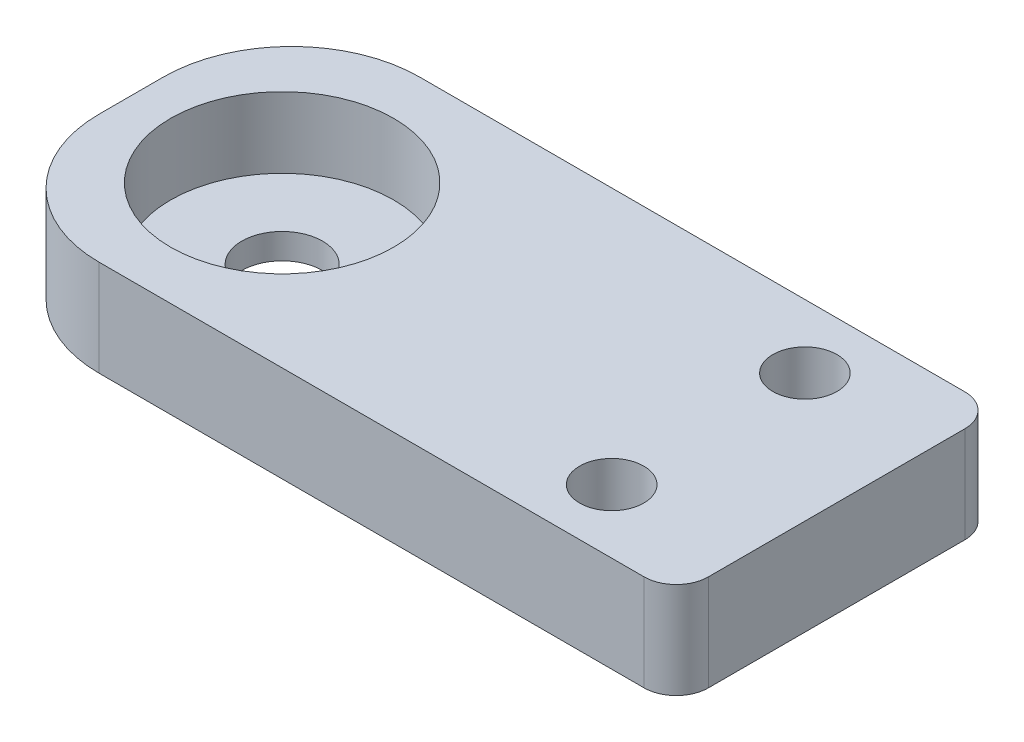
ISO-10303-21;
HEADER;
FILE_DESCRIPTION(('STEP AP214'),'2;1');
FILE_NAME('part.step','',(''),(''),'','','');
FILE_SCHEMA(('AUTOMOTIVE_DESIGN { 1 0 10303 214 1 1 1 1 }'));
ENDSEC;
DATA;
#1=APPLICATION_CONTEXT('core data for automotive mechanical design processes');
#2=APPLICATION_PROTOCOL_DEFINITION('international standard','automotive_design',2000,#1);
#3=PRODUCT_CONTEXT('',#1,'mechanical');
#4=PRODUCT('Part','Part','',(#3));
#5=PRODUCT_RELATED_PRODUCT_CATEGORY('part','',(#4));
#6=PRODUCT_DEFINITION_FORMATION('','',#4);
#7=PRODUCT_DEFINITION_CONTEXT('part definition',#1,'design');
#8=PRODUCT_DEFINITION('design','',#6,#7);
#9=PRODUCT_DEFINITION_SHAPE('','',#8);
#10=(LENGTH_UNIT() NAMED_UNIT(*) SI_UNIT(.MILLI.,.METRE.));
#11=(NAMED_UNIT(*) PLANE_ANGLE_UNIT() SI_UNIT($,.RADIAN.));
#12=(NAMED_UNIT(*) SI_UNIT($,.STERADIAN.) SOLID_ANGLE_UNIT());
#13=UNCERTAINTY_MEASURE_WITH_UNIT(LENGTH_MEASURE(1.E-05),#10,'distance_accuracy_value','');
#14=(GEOMETRIC_REPRESENTATION_CONTEXT(3) GLOBAL_UNCERTAINTY_ASSIGNED_CONTEXT((#13)) GLOBAL_UNIT_ASSIGNED_CONTEXT((#10,
#11,#12)) REPRESENTATION_CONTEXT('',''));
#15=CARTESIAN_POINT('',(0.,0.,0.));
#16=DIRECTION('',(0.,0.,1.));
#17=DIRECTION('',(1.,0.,0.));
#18=AXIS2_PLACEMENT_3D('',#15,#16,#17);
#19=CARTESIAN_POINT('',(14.950000072,9.525,-15.875));
#20=DIRECTION('',(0.,-1.,0.));
#21=DIRECTION('',(0.,0.,-1.));
#22=AXIS2_PLACEMENT_3D('',#19,#20,#21);
#23=CYLINDRICAL_SURFACE('',#22,4.);
#24=CARTESIAN_POINT('',(14.950000072,0.,-15.875));
#25=DIRECTION('',(0.,1.,0.));
#26=DIRECTION('',(0.,0.,1.));
#27=AXIS2_PLACEMENT_3D('',#24,#25,#26);
#28=CIRCLE('',#27,4.);
#29=CARTESIAN_POINT('',(14.950000072,0.,-19.875));
#30=VERTEX_POINT('',#29);
#31=EDGE_CURVE('E127',#30,#30,#28,.T.);
#32=CARTESIAN_POINT('',(14.950000072,2.525,-15.875));
#33=DIRECTION('',(0.,1.,0.));
#34=DIRECTION('',(0.,0.,1.));
#35=AXIS2_PLACEMENT_3D('',#32,#33,#34);
#36=CIRCLE('',#35,4.);
#37=CARTESIAN_POINT('',(14.950000072,2.525,-19.875));
#38=VERTEX_POINT('',#37);
#39=EDGE_CURVE('E141',#38,#38,#36,.T.);
#40=CARTESIAN_POINT('',(14.950000072,0.,-19.875));
#41=CARTESIAN_POINT('',(14.950000072,0.0263020833333333,-19.875));
#42=CARTESIAN_POINT('',(14.950000072,0.0526041666666667,-19.875));
#43=CARTESIAN_POINT('',(14.950000072,0.105208333333333,-19.875));
#44=CARTESIAN_POINT('',(14.950000072,0.131510416666667,-19.875));
#45=CARTESIAN_POINT('',(14.950000072,0.184114583333333,-19.875));
#46=CARTESIAN_POINT('',(14.950000072,0.210416666666667,-19.875));
#47=CARTESIAN_POINT('',(14.950000072,0.263020833333333,-19.875));
#48=CARTESIAN_POINT('',(14.950000072,0.289322916666667,-19.875));
#49=CARTESIAN_POINT('',(14.950000072,0.341927083333333,-19.875));
#50=CARTESIAN_POINT('',(14.950000072,0.368229166666667,-19.875));
#51=CARTESIAN_POINT('',(14.950000072,0.420833333333333,-19.875));
#52=CARTESIAN_POINT('',(14.950000072,0.447135416666667,-19.875));
#53=CARTESIAN_POINT('',(14.950000072,0.499739583333333,-19.875));
#54=CARTESIAN_POINT('',(14.950000072,0.526041666666667,-19.875));
#55=CARTESIAN_POINT('',(14.950000072,0.578645833333333,-19.875));
#56=CARTESIAN_POINT('',(14.950000072,0.604947916666666,-19.875));
#57=CARTESIAN_POINT('',(14.950000072,0.657552083333333,-19.875));
#58=CARTESIAN_POINT('',(14.950000072,0.683854166666667,-19.875));
#59=CARTESIAN_POINT('',(14.950000072,0.736458333333333,-19.875));
#60=CARTESIAN_POINT('',(14.950000072,0.762760416666666,-19.875));
#61=CARTESIAN_POINT('',(14.950000072,0.815364583333333,-19.875));
#62=CARTESIAN_POINT('',(14.950000072,0.841666666666666,-19.875));
#63=CARTESIAN_POINT('',(14.950000072,0.894270833333333,-19.875));
#64=CARTESIAN_POINT('',(14.950000072,0.920572916666666,-19.875));
#65=CARTESIAN_POINT('',(14.950000072,0.973177083333333,-19.875));
#66=CARTESIAN_POINT('',(14.950000072,0.999479166666666,-19.875));
#67=CARTESIAN_POINT('',(14.950000072,1.05208333333333,-19.875));
#68=CARTESIAN_POINT('',(14.950000072,1.07838541666667,-19.875));
#69=CARTESIAN_POINT('',(14.950000072,1.13098958333333,-19.875));
#70=CARTESIAN_POINT('',(14.950000072,1.15729166666667,-19.875));
#71=CARTESIAN_POINT('',(14.950000072,1.20989583333333,-19.875));
#72=CARTESIAN_POINT('',(14.950000072,1.23619791666667,-19.875));
#73=CARTESIAN_POINT('',(14.950000072,1.28880208333333,-19.875));
#74=CARTESIAN_POINT('',(14.950000072,1.31510416666667,-19.875));
#75=CARTESIAN_POINT('',(14.950000072,1.36770833333333,-19.875));
#76=CARTESIAN_POINT('',(14.950000072,1.39401041666667,-19.875));
#77=CARTESIAN_POINT('',(14.950000072,1.44661458333333,-19.875));
#78=CARTESIAN_POINT('',(14.950000072,1.47291666666667,-19.875));
#79=CARTESIAN_POINT('',(14.950000072,1.52552083333333,-19.875));
#80=CARTESIAN_POINT('',(14.950000072,1.55182291666667,-19.875));
#81=CARTESIAN_POINT('',(14.950000072,1.60442708333333,-19.875));
#82=CARTESIAN_POINT('',(14.950000072,1.63072916666667,-19.875));
#83=CARTESIAN_POINT('',(14.950000072,1.68333333333333,-19.875));
#84=CARTESIAN_POINT('',(14.950000072,1.70963541666667,-19.875));
#85=CARTESIAN_POINT('',(14.950000072,1.76223958333333,-19.875));
#86=CARTESIAN_POINT('',(14.950000072,1.78854166666667,-19.875));
#87=CARTESIAN_POINT('',(14.950000072,1.84114583333333,-19.875));
#88=CARTESIAN_POINT('',(14.950000072,1.86744791666667,-19.875));
#89=CARTESIAN_POINT('',(14.950000072,1.92005208333333,-19.875));
#90=CARTESIAN_POINT('',(14.950000072,1.94635416666667,-19.875));
#91=CARTESIAN_POINT('',(14.950000072,1.99895833333333,-19.875));
#92=CARTESIAN_POINT('',(14.950000072,2.02526041666667,-19.875));
#93=CARTESIAN_POINT('',(14.950000072,2.07786458333333,-19.875));
#94=CARTESIAN_POINT('',(14.950000072,2.10416666666667,-19.875));
#95=CARTESIAN_POINT('',(14.950000072,2.15677083333333,-19.875));
#96=CARTESIAN_POINT('',(14.950000072,2.18307291666667,-19.875));
#97=CARTESIAN_POINT('',(14.950000072,2.23567708333333,-19.875));
#98=CARTESIAN_POINT('',(14.950000072,2.26197916666667,-19.875));
#99=CARTESIAN_POINT('',(14.950000072,2.31458333333333,-19.875));
#100=CARTESIAN_POINT('',(14.950000072,2.34088541666667,-19.875));
#101=CARTESIAN_POINT('',(14.950000072,2.39348958333333,-19.875));
#102=CARTESIAN_POINT('',(14.950000072,2.41979166666667,-19.875));
#103=CARTESIAN_POINT('',(14.950000072,2.47239583333333,-19.875));
#104=CARTESIAN_POINT('',(14.950000072,2.49869791666667,-19.875));
#105=CARTESIAN_POINT('',(14.950000072,2.525,-19.875));
#106=B_SPLINE_CURVE_WITH_KNOTS('',3,(#40,#41,#42,#43,#44,#45,#46,#47,#48,#49,#50,#51,#52,#53,
#54,#55,#56,#57,#58,#59,#60,#61,#62,#63,#64,#65,#66,#67,#68,#69,#70,#71,#72,#73,#74,#75,#76,#77,
#78,#79,#80,#81,#82,#83,#84,#85,#86,#87,#88,#89,#90,#91,#92,#93,#94,#95,#96,#97,#98,#99,#100,
#101,#102,#103,#104,#105),.UNSPECIFIED.,.F.,.F.,(4,2,2,2,2,2,2,2,2,2,2,2,2,2,2,2,2,2,2,2,2,2,2,
2,2,2,2,2,2,2,2,2,4),(0.,0.07890625,0.1578125,0.23671875,0.315625,0.39453125,0.4734375,
0.55234375,0.63125,0.71015625,0.7890625,0.86796875,0.946875,1.02578125,1.1046875,1.18359375,
1.2625,1.34140625,1.4203125,1.49921875,1.578125,1.65703125,1.7359375,1.81484375,1.89375,
1.97265625,2.0515625,2.13046875,2.209375,2.28828125,2.3671875,2.44609375,2.525),.UNSPECIFIED.);
#107=EDGE_CURVE('BSEAM33',#30,#38,#106,.T.);
#108=ORIENTED_EDGE('',*,*,#31,.F.);
#109=ORIENTED_EDGE('',*,*,#39,.T.);
#110=ORIENTED_EDGE('',*,*,#107,.T.);
#111=ORIENTED_EDGE('',*,*,#107,.F.);
#112=EDGE_LOOP('',(#108,#110,#109,#111));
#113=FACE_BOUND('',#112,.T.);
#114=ADVANCED_FACE('F33',(#113),#23,.F.);
#115=CARTESIAN_POINT('',(0.,9.525,0.));
#116=DIRECTION('',(0.,-1.,0.));
#117=DIRECTION('',(0.,0.,-1.));
#118=AXIS2_PLACEMENT_3D('',#115,#116,#117);
#119=PLANE('',#118);
#120=CARTESIAN_POINT('',(14.950000072,9.525,-15.875));
#121=DIRECTION('',(0.,1.,0.));
#122=DIRECTION('',(0.,0.,1.));
#123=AXIS2_PLACEMENT_3D('',#120,#121,#122);
#124=CIRCLE('',#123,11.05);
#125=CARTESIAN_POINT('',(14.950000072,9.525,-4.82499999999999));
#126=VERTEX_POINT('',#125);
#127=EDGE_CURVE('E203',#126,#126,#124,.T.);
#128=ORIENTED_EDGE('',*,*,#127,.F.);
#129=EDGE_LOOP('',(#128));
#130=FACE_BOUND('',#129,.T.);
#131=CARTESIAN_POINT('',(57.15,9.525,-25.441087639125));
#132=DIRECTION('',(0.,1.,0.));
#133=DIRECTION('',(0.,0.,1.));
#134=AXIS2_PLACEMENT_3D('',#131,#132,#133);
#135=CIRCLE('',#134,3.175);
#136=CARTESIAN_POINT('',(57.15,9.525,-28.616087639125));
#137=VERTEX_POINT('',#136);
#138=EDGE_CURVE('E132',#137,#137,#135,.T.);
#139=ORIENTED_EDGE('',*,*,#138,.F.);
#140=EDGE_LOOP('',(#139));
#141=FACE_BOUND('',#140,.T.);
#142=DIRECTION('',(0.,0.,-1.));
#143=VECTOR('',#142,1.);
#144=CARTESIAN_POINT('',(69.85,9.525,0.));
#145=LINE('',#144,#143);
#146=CARTESIAN_POINT('',(69.85,9.525,-3.175));
#147=VERTEX_POINT('',#146);
#148=CARTESIAN_POINT('',(69.85,9.525,-28.575));
#149=VERTEX_POINT('',#148);
#150=EDGE_CURVE('E173',#147,#149,#145,.T.);
#151=ORIENTED_EDGE('',*,*,#150,.T.);
#152=CARTESIAN_POINT('',(66.675,9.525,-28.575));
#153=DIRECTION('',(0.,-1.,0.));
#154=DIRECTION('',(0.,0.,-1.));
#155=AXIS2_PLACEMENT_3D('',#152,#153,#154);
#156=CIRCLE('',#155,3.175);
#157=CARTESIAN_POINT('',(66.675,9.525,-31.75));
#158=VERTEX_POINT('',#157);
#159=EDGE_CURVE('E41',#149,#158,#156,.F.);
#160=ORIENTED_EDGE('',*,*,#159,.T.);
#161=DIRECTION('',(-1.,0.,0.));
#162=VECTOR('',#161,1.);
#163=CARTESIAN_POINT('',(0.,9.525,-31.75));
#164=LINE('',#163,#162);
#165=CARTESIAN_POINT('',(12.7,9.525,-31.75));
#166=VERTEX_POINT('',#165);
#167=EDGE_CURVE('E135',#158,#166,#164,.T.);
#168=ORIENTED_EDGE('',*,*,#167,.T.);
#169=CARTESIAN_POINT('',(12.7,9.525,-19.05));
#170=DIRECTION('',(0.,-1.,0.));
#171=DIRECTION('',(0.,0.,-1.));
#172=AXIS2_PLACEMENT_3D('',#169,#170,#171);
#173=CIRCLE('',#172,12.7);
#174=CARTESIAN_POINT('',(0.,9.525,-19.05));
#175=VERTEX_POINT('',#174);
#176=EDGE_CURVE('E151',#166,#175,#173,.F.);
#177=ORIENTED_EDGE('',*,*,#176,.T.);
#178=DIRECTION('',(0.,0.,1.));
#179=VECTOR('',#178,1.);
#180=CARTESIAN_POINT('',(0.,9.525,0.));
#181=LINE('',#180,#179);
#182=CARTESIAN_POINT('',(0.,9.525,-12.7));
#183=VERTEX_POINT('',#182);
#184=EDGE_CURVE('E120',#175,#183,#181,.T.);
#185=ORIENTED_EDGE('',*,*,#184,.T.);
#186=CARTESIAN_POINT('',(12.7,9.525,-12.7));
#187=DIRECTION('',(0.,-1.,0.));
#188=DIRECTION('',(0.,0.,-1.));
#189=AXIS2_PLACEMENT_3D('',#186,#187,#188);
#190=CIRCLE('',#189,12.7);
#191=CARTESIAN_POINT('',(12.7,9.525,0.));
#192=VERTEX_POINT('',#191);
#193=EDGE_CURVE('E149',#183,#192,#190,.F.);
#194=ORIENTED_EDGE('',*,*,#193,.T.);
#195=DIRECTION('',(1.,0.,0.));
#196=VECTOR('',#195,1.);
#197=CARTESIAN_POINT('',(0.,9.525,0.));
#198=LINE('',#197,#196);
#199=CARTESIAN_POINT('',(66.675,9.525,0.));
#200=VERTEX_POINT('',#199);
#201=EDGE_CURVE('E186',#192,#200,#198,.T.);
#202=ORIENTED_EDGE('',*,*,#201,.T.);
#203=CARTESIAN_POINT('',(66.675,9.525,-3.175));
#204=DIRECTION('',(0.,-1.,0.));
#205=DIRECTION('',(0.,0.,-1.));
#206=AXIS2_PLACEMENT_3D('',#203,#204,#205);
#207=CIRCLE('',#206,3.175);
#208=EDGE_CURVE('E167',#200,#147,#207,.F.);
#209=ORIENTED_EDGE('',*,*,#208,.T.);
#210=EDGE_LOOP('',(#151,#160,#168,#177,#185,#194,#202,#209));
#211=FACE_BOUND('',#210,.T.);
#212=CARTESIAN_POINT('',(57.15,9.525,-6.30891236087502));
#213=DIRECTION('',(0.,1.,0.));
#214=DIRECTION('',(0.,0.,-1.));
#215=AXIS2_PLACEMENT_3D('',#212,#213,#214);
#216=CIRCLE('',#215,3.175);
#217=CARTESIAN_POINT('',(57.15,9.525,-9.48391236087502));
#218=VERTEX_POINT('',#217);
#219=EDGE_CURVE('E196',#218,#218,#216,.T.);
#220=ORIENTED_EDGE('',*,*,#219,.F.);
#221=EDGE_LOOP('',(#220));
#222=FACE_BOUND('',#221,.T.);
#223=ADVANCED_FACE('F171',(#130,#141,#211,#222),#119,.F.);
#224=CARTESIAN_POINT('',(0.,0.,0.));
#225=DIRECTION('',(0.,-1.,0.));
#226=DIRECTION('',(0.,0.,-1.));
#227=AXIS2_PLACEMENT_3D('',#224,#225,#226);
#228=PLANE('',#227);
#229=CARTESIAN_POINT('',(57.15,0.,-25.441087639125));
#230=DIRECTION('',(0.,1.,0.));
#231=DIRECTION('',(0.,0.,1.));
#232=AXIS2_PLACEMENT_3D('',#229,#230,#231);
#233=CIRCLE('',#232,3.175);
#234=CARTESIAN_POINT('',(57.15,0.,-28.616087639125));
#235=VERTEX_POINT('',#234);
#236=EDGE_CURVE('E193',#235,#235,#233,.T.);
#237=ORIENTED_EDGE('',*,*,#236,.T.);
#238=EDGE_LOOP('',(#237));
#239=FACE_BOUND('',#238,.T.);
#240=DIRECTION('',(-1.,0.,0.));
#241=VECTOR('',#240,1.);
#242=CARTESIAN_POINT('',(0.,0.,-31.75));
#243=LINE('',#242,#241);
#244=CARTESIAN_POINT('',(66.675,0.,-31.75));
#245=VERTEX_POINT('',#244);
#246=CARTESIAN_POINT('',(12.7,0.,-31.75));
#247=VERTEX_POINT('',#246);
#248=EDGE_CURVE('E139',#245,#247,#243,.T.);
#249=ORIENTED_EDGE('',*,*,#248,.F.);
#250=CARTESIAN_POINT('',(66.675,0.,-28.575));
#251=DIRECTION('',(0.,-1.,0.));
#252=DIRECTION('',(0.,0.,-1.));
#253=AXIS2_PLACEMENT_3D('',#250,#251,#252);
#254=CIRCLE('',#253,3.175);
#255=CARTESIAN_POINT('',(69.85,0.,-28.575));
#256=VERTEX_POINT('',#255);
#257=EDGE_CURVE('E161',#245,#256,#254,.T.);
#258=ORIENTED_EDGE('',*,*,#257,.T.);
#259=DIRECTION('',(0.,0.,-1.));
#260=VECTOR('',#259,1.);
#261=CARTESIAN_POINT('',(69.85,0.,0.));
#262=LINE('',#261,#260);
#263=CARTESIAN_POINT('',(69.85,0.,-3.175));
#264=VERTEX_POINT('',#263);
#265=EDGE_CURVE('E129',#264,#256,#262,.T.);
#266=ORIENTED_EDGE('',*,*,#265,.F.);
#267=CARTESIAN_POINT('',(66.675,0.,-3.175));
#268=DIRECTION('',(0.,-1.,0.));
#269=DIRECTION('',(0.,0.,-1.));
#270=AXIS2_PLACEMENT_3D('',#267,#268,#269);
#271=CIRCLE('',#270,3.175);
#272=CARTESIAN_POINT('',(66.675,0.,0.));
#273=VERTEX_POINT('',#272);
#274=EDGE_CURVE('E159',#264,#273,#271,.T.);
#275=ORIENTED_EDGE('',*,*,#274,.T.);
#276=DIRECTION('',(1.,0.,0.));
#277=VECTOR('',#276,1.);
#278=CARTESIAN_POINT('',(0.,0.,0.));
#279=LINE('',#278,#277);
#280=CARTESIAN_POINT('',(12.7,0.,0.));
#281=VERTEX_POINT('',#280);
#282=EDGE_CURVE('E126',#281,#273,#279,.T.);
#283=ORIENTED_EDGE('',*,*,#282,.F.);
#284=CARTESIAN_POINT('',(12.7,0.,-12.7));
#285=DIRECTION('',(0.,-1.,0.));
#286=DIRECTION('',(0.,0.,-1.));
#287=AXIS2_PLACEMENT_3D('',#284,#285,#286);
#288=CIRCLE('',#287,12.7);
#289=CARTESIAN_POINT('',(0.,0.,-12.7));
#290=VERTEX_POINT('',#289);
#291=EDGE_CURVE('E111',#281,#290,#288,.T.);
#292=ORIENTED_EDGE('',*,*,#291,.T.);
#293=DIRECTION('',(0.,0.,1.));
#294=VECTOR('',#293,1.);
#295=CARTESIAN_POINT('',(0.,0.,0.));
#296=LINE('',#295,#294);
#297=CARTESIAN_POINT('',(0.,0.,-19.05));
#298=VERTEX_POINT('',#297);
#299=EDGE_CURVE('E117',#298,#290,#296,.T.);
#300=ORIENTED_EDGE('',*,*,#299,.F.);
#301=CARTESIAN_POINT('',(12.7,0.,-19.05));
#302=DIRECTION('',(0.,-1.,0.));
#303=DIRECTION('',(0.,0.,-1.));
#304=AXIS2_PLACEMENT_3D('',#301,#302,#303);
#305=CIRCLE('',#304,12.7);
#306=EDGE_CURVE('E101',#298,#247,#305,.T.);
#307=ORIENTED_EDGE('',*,*,#306,.T.);
#308=EDGE_LOOP('',(#249,#258,#266,#275,#283,#292,#300,#307));
#309=FACE_BOUND('',#308,.T.);
#310=ORIENTED_EDGE('',*,*,#31,.T.);
#311=EDGE_LOOP('',(#310));
#312=FACE_BOUND('',#311,.T.);
#313=CARTESIAN_POINT('',(57.15,0.,-6.30891236087502));
#314=DIRECTION('',(0.,1.,0.));
#315=DIRECTION('',(0.,0.,-1.));
#316=AXIS2_PLACEMENT_3D('',#313,#314,#315);
#317=CIRCLE('',#316,3.175);
#318=CARTESIAN_POINT('',(57.15,0.,-9.48391236087502));
#319=VERTEX_POINT('',#318);
#320=EDGE_CURVE('E144',#319,#319,#317,.T.);
#321=ORIENTED_EDGE('',*,*,#320,.T.);
#322=EDGE_LOOP('',(#321));
#323=FACE_BOUND('',#322,.T.);
#324=ADVANCED_FACE('F123',(#239,#309,#312,#323),#228,.T.);
#325=CARTESIAN_POINT('',(0.,9.525,0.));
#326=DIRECTION('',(1.,0.,0.));
#327=DIRECTION('',(0.,0.,-1.));
#328=AXIS2_PLACEMENT_3D('',#325,#326,#327);
#329=PLANE('',#328);
#330=ORIENTED_EDGE('',*,*,#184,.F.);
#331=DIRECTION('',(0.,-1.,0.));
#332=VECTOR('',#331,1.);
#333=CARTESIAN_POINT('',(0.,9.525,-19.05));
#334=LINE('',#333,#332);
#335=EDGE_CURVE('E105',#175,#298,#334,.T.);
#336=ORIENTED_EDGE('',*,*,#335,.T.);
#337=ORIENTED_EDGE('',*,*,#299,.T.);
#338=DIRECTION('',(0.,-1.,0.));
#339=VECTOR('',#338,1.);
#340=CARTESIAN_POINT('',(0.,9.525,-12.7));
#341=LINE('',#340,#339);
#342=EDGE_CURVE('E121',#290,#183,#341,.F.);
#343=ORIENTED_EDGE('',*,*,#342,.T.);
#344=EDGE_LOOP('',(#330,#336,#337,#343));
#345=FACE_BOUND('',#344,.T.);
#346=ADVANCED_FACE('F116',(#345),#329,.F.);
#347=CARTESIAN_POINT('',(0.,9.525,0.));
#348=DIRECTION('',(0.,0.,-1.));
#349=DIRECTION('',(-1.,0.,0.));
#350=AXIS2_PLACEMENT_3D('',#347,#348,#349);
#351=PLANE('',#350);
#352=ORIENTED_EDGE('',*,*,#282,.T.);
#353=DIRECTION('',(0.,-1.,0.));
#354=VECTOR('',#353,1.);
#355=CARTESIAN_POINT('',(66.675,9.525,0.));
#356=LINE('',#355,#354);
#357=EDGE_CURVE('E11',#273,#200,#356,.F.);
#358=ORIENTED_EDGE('',*,*,#357,.T.);
#359=ORIENTED_EDGE('',*,*,#201,.F.);
#360=DIRECTION('',(0.,-1.,0.));
#361=VECTOR('',#360,1.);
#362=CARTESIAN_POINT('',(12.7,9.525,0.));
#363=LINE('',#362,#361);
#364=EDGE_CURVE('E153',#192,#281,#363,.T.);
#365=ORIENTED_EDGE('',*,*,#364,.T.);
#366=EDGE_LOOP('',(#352,#358,#359,#365));
#367=FACE_BOUND('',#366,.T.);
#368=ADVANCED_FACE('F184',(#367),#351,.F.);
#369=CARTESIAN_POINT('',(69.85,9.525,0.));
#370=DIRECTION('',(-1.,0.,0.));
#371=DIRECTION('',(0.,0.,1.));
#372=AXIS2_PLACEMENT_3D('',#369,#370,#371);
#373=PLANE('',#372);
#374=ORIENTED_EDGE('',*,*,#265,.T.);
#375=DIRECTION('',(0.,-1.,0.));
#376=VECTOR('',#375,1.);
#377=CARTESIAN_POINT('',(69.85,9.525,-28.575));
#378=LINE('',#377,#376);
#379=EDGE_CURVE('E54',#256,#149,#378,.F.);
#380=ORIENTED_EDGE('',*,*,#379,.T.);
#381=ORIENTED_EDGE('',*,*,#150,.F.);
#382=DIRECTION('',(0.,-1.,0.));
#383=VECTOR('',#382,1.);
#384=CARTESIAN_POINT('',(69.85,9.525,-3.175));
#385=LINE('',#384,#383);
#386=EDGE_CURVE('E163',#147,#264,#385,.T.);
#387=ORIENTED_EDGE('',*,*,#386,.T.);
#388=EDGE_LOOP('',(#374,#380,#381,#387));
#389=FACE_BOUND('',#388,.T.);
#390=ADVANCED_FACE('F180',(#389),#373,.F.);
#391=CARTESIAN_POINT('',(0.,9.525,-31.75));
#392=DIRECTION('',(0.,0.,1.));
#393=DIRECTION('',(1.,0.,0.));
#394=AXIS2_PLACEMENT_3D('',#391,#392,#393);
#395=PLANE('',#394);
#396=ORIENTED_EDGE('',*,*,#167,.F.);
#397=DIRECTION('',(0.,-1.,0.));
#398=VECTOR('',#397,1.);
#399=CARTESIAN_POINT('',(66.675,9.525,-31.75));
#400=LINE('',#399,#398);
#401=EDGE_CURVE('E156',#158,#245,#400,.T.);
#402=ORIENTED_EDGE('',*,*,#401,.T.);
#403=ORIENTED_EDGE('',*,*,#248,.T.);
#404=DIRECTION('',(0.,-1.,0.));
#405=VECTOR('',#404,1.);
#406=CARTESIAN_POINT('',(12.7,9.525,-31.75));
#407=LINE('',#406,#405);
#408=EDGE_CURVE('E107',#247,#166,#407,.F.);
#409=ORIENTED_EDGE('',*,*,#408,.T.);
#410=EDGE_LOOP('',(#396,#402,#403,#409));
#411=FACE_BOUND('',#410,.T.);
#412=ADVANCED_FACE('F177',(#411),#395,.F.);
#413=CARTESIAN_POINT('',(57.15,9.525,-25.441087639125));
#414=DIRECTION('',(0.,-1.,0.));
#415=DIRECTION('',(0.,0.,-1.));
#416=AXIS2_PLACEMENT_3D('',#413,#414,#415);
#417=CYLINDRICAL_SURFACE('',#416,3.175);
#418=CARTESIAN_POINT('',(57.15,9.525,-28.616087639125));
#419=CARTESIAN_POINT('',(57.15,9.42578125,-28.616087639125));
#420=CARTESIAN_POINT('',(57.15,9.3265625,-28.616087639125));
#421=CARTESIAN_POINT('',(57.15,9.128125,-28.616087639125));
#422=CARTESIAN_POINT('',(57.15,9.02890625,-28.616087639125));
#423=CARTESIAN_POINT('',(57.15,8.83046875,-28.616087639125));
#424=CARTESIAN_POINT('',(57.15,8.73125,-28.616087639125));
#425=CARTESIAN_POINT('',(57.15,8.5328125,-28.616087639125));
#426=CARTESIAN_POINT('',(57.15,8.43359375,-28.616087639125));
#427=CARTESIAN_POINT('',(57.15,8.23515625,-28.616087639125));
#428=CARTESIAN_POINT('',(57.15,8.1359375,-28.616087639125));
#429=CARTESIAN_POINT('',(57.15,7.9375,-28.616087639125));
#430=CARTESIAN_POINT('',(57.15,7.83828125,-28.616087639125));
#431=CARTESIAN_POINT('',(57.15,7.63984375,-28.616087639125));
#432=CARTESIAN_POINT('',(57.15,7.540625,-28.616087639125));
#433=CARTESIAN_POINT('',(57.15,7.3421875,-28.616087639125));
#434=CARTESIAN_POINT('',(57.15,7.24296875,-28.616087639125));
#435=CARTESIAN_POINT('',(57.15,7.04453125,-28.616087639125));
#436=CARTESIAN_POINT('',(57.15,6.9453125,-28.616087639125));
#437=CARTESIAN_POINT('',(57.15,6.746875,-28.616087639125));
#438=CARTESIAN_POINT('',(57.15,6.64765625,-28.616087639125));
#439=CARTESIAN_POINT('',(57.15,6.44921875,-28.616087639125));
#440=CARTESIAN_POINT('',(57.15,6.35,-28.616087639125));
#441=CARTESIAN_POINT('',(57.15,6.1515625,-28.616087639125));
#442=CARTESIAN_POINT('',(57.15,6.05234375,-28.616087639125));
#443=CARTESIAN_POINT('',(57.15,5.85390625,-28.616087639125));
#444=CARTESIAN_POINT('',(57.15,5.7546875,-28.616087639125));
#445=CARTESIAN_POINT('',(57.15,5.55625,-28.616087639125));
#446=CARTESIAN_POINT('',(57.15,5.45703125,-28.616087639125));
#447=CARTESIAN_POINT('',(57.15,5.25859375,-28.616087639125));
#448=CARTESIAN_POINT('',(57.15,5.159375,-28.616087639125));
#449=CARTESIAN_POINT('',(57.15,4.9609375,-28.616087639125));
#450=CARTESIAN_POINT('',(57.15,4.86171875,-28.616087639125));
#451=CARTESIAN_POINT('',(57.15,4.66328125,-28.616087639125));
#452=CARTESIAN_POINT('',(57.15,4.5640625,-28.616087639125));
#453=CARTESIAN_POINT('',(57.15,4.365625,-28.616087639125));
#454=CARTESIAN_POINT('',(57.15,4.26640625,-28.616087639125));
#455=CARTESIAN_POINT('',(57.15,4.06796875,-28.616087639125));
#456=CARTESIAN_POINT('',(57.15,3.96875,-28.616087639125));
#457=CARTESIAN_POINT('',(57.15,3.7703125,-28.616087639125));
#458=CARTESIAN_POINT('',(57.15,3.67109375,-28.616087639125));
#459=CARTESIAN_POINT('',(57.15,3.47265625,-28.616087639125));
#460=CARTESIAN_POINT('',(57.15,3.3734375,-28.616087639125));
#461=CARTESIAN_POINT('',(57.15,3.175,-28.616087639125));
#462=CARTESIAN_POINT('',(57.15,3.07578125,-28.616087639125));
#463=CARTESIAN_POINT('',(57.15,2.87734375,-28.616087639125));
#464=CARTESIAN_POINT('',(57.15,2.778125,-28.616087639125));
#465=CARTESIAN_POINT('',(57.15,2.5796875,-28.616087639125));
#466=CARTESIAN_POINT('',(57.15,2.48046875,-28.616087639125));
#467=CARTESIAN_POINT('',(57.15,2.28203125,-28.616087639125));
#468=CARTESIAN_POINT('',(57.15,2.1828125,-28.616087639125));
#469=CARTESIAN_POINT('',(57.15,1.984375,-28.616087639125));
#470=CARTESIAN_POINT('',(57.15,1.88515625,-28.616087639125));
#471=CARTESIAN_POINT('',(57.15,1.68671875,-28.616087639125));
#472=CARTESIAN_POINT('',(57.15,1.5875,-28.616087639125));
#473=CARTESIAN_POINT('',(57.15,1.3890625,-28.616087639125));
#474=CARTESIAN_POINT('',(57.15,1.28984375,-28.616087639125));
#475=CARTESIAN_POINT('',(57.15,1.09140625,-28.616087639125));
#476=CARTESIAN_POINT('',(57.15,0.992187500000001,-28.616087639125));
#477=CARTESIAN_POINT('',(57.15,0.793750000000001,-28.616087639125));
#478=CARTESIAN_POINT('',(57.15,0.69453125,-28.616087639125));
#479=CARTESIAN_POINT('',(57.15,0.49609375,-28.616087639125));
#480=CARTESIAN_POINT('',(57.15,0.396875,-28.616087639125));
#481=CARTESIAN_POINT('',(57.15,0.1984375,-28.616087639125));
#482=CARTESIAN_POINT('',(57.15,0.0992187500000001,-28.616087639125));
#483=CARTESIAN_POINT('',(57.15,0.,-28.616087639125));
#484=B_SPLINE_CURVE_WITH_KNOTS('',3,(#418,#419,#420,#421,#422,#423,#424,#425,#426,#427,#428,
#429,#430,#431,#432,#433,#434,#435,#436,#437,#438,#439,#440,#441,#442,#443,#444,#445,#446,#447,
#448,#449,#450,#451,#452,#453,#454,#455,#456,#457,#458,#459,#460,#461,#462,#463,#464,#465,#466,
#467,#468,#469,#470,#471,#472,#473,#474,#475,#476,#477,#478,#479,#480,#481,#482,#483),
.UNSPECIFIED.,.F.,.F.,(4,2,2,2,2,2,2,2,2,2,2,2,2,2,2,2,2,2,2,2,2,2,2,2,2,2,2,2,2,2,2,2,4),(0.,
0.29765625,0.5953125,0.892968750000001,1.190625,1.48828125,1.7859375,2.08359375,2.38125,
2.67890625,2.9765625,3.27421875,3.571875,3.86953125,4.1671875,4.46484375,4.7625,5.06015625,
5.3578125,5.65546875,5.953125,6.25078125,6.5484375,6.84609375,7.14375,7.44140625,7.7390625,
8.03671875,8.334375,8.63203125,8.9296875,9.22734375,9.525),.UNSPECIFIED.);
#485=EDGE_CURVE('BSEAM223',#137,#235,#484,.T.);
#486=ORIENTED_EDGE('',*,*,#138,.T.);
#487=ORIENTED_EDGE('',*,*,#236,.F.);
#488=ORIENTED_EDGE('',*,*,#485,.T.);
#489=ORIENTED_EDGE('',*,*,#485,.F.);
#490=EDGE_LOOP('',(#486,#488,#487,#489));
#491=FACE_BOUND('',#490,.T.);
#492=ADVANCED_FACE('F223',(#491),#417,.F.);
#493=CARTESIAN_POINT('',(57.15,9.525,-6.30891236087502));
#494=DIRECTION('',(0.,-1.,0.));
#495=DIRECTION('',(0.,0.,-1.));
#496=AXIS2_PLACEMENT_3D('',#493,#494,#495);
#497=CYLINDRICAL_SURFACE('',#496,3.175);
#498=CARTESIAN_POINT('',(57.15,9.525,-9.48391236087502));
#499=CARTESIAN_POINT('',(57.15,9.42578125,-9.48391236087502));
#500=CARTESIAN_POINT('',(57.15,9.3265625,-9.48391236087502));
#501=CARTESIAN_POINT('',(57.15,9.128125,-9.48391236087502));
#502=CARTESIAN_POINT('',(57.15,9.02890625,-9.48391236087502));
#503=CARTESIAN_POINT('',(57.15,8.83046875,-9.48391236087502));
#504=CARTESIAN_POINT('',(57.15,8.73125,-9.48391236087502));
#505=CARTESIAN_POINT('',(57.15,8.5328125,-9.48391236087502));
#506=CARTESIAN_POINT('',(57.15,8.43359375,-9.48391236087502));
#507=CARTESIAN_POINT('',(57.15,8.23515625,-9.48391236087502));
#508=CARTESIAN_POINT('',(57.15,8.1359375,-9.48391236087502));
#509=CARTESIAN_POINT('',(57.15,7.9375,-9.48391236087502));
#510=CARTESIAN_POINT('',(57.15,7.83828125,-9.48391236087502));
#511=CARTESIAN_POINT('',(57.15,7.63984375,-9.48391236087502));
#512=CARTESIAN_POINT('',(57.15,7.540625,-9.48391236087502));
#513=CARTESIAN_POINT('',(57.15,7.3421875,-9.48391236087502));
#514=CARTESIAN_POINT('',(57.15,7.24296875,-9.48391236087502));
#515=CARTESIAN_POINT('',(57.15,7.04453125,-9.48391236087502));
#516=CARTESIAN_POINT('',(57.15,6.9453125,-9.48391236087502));
#517=CARTESIAN_POINT('',(57.15,6.746875,-9.48391236087502));
#518=CARTESIAN_POINT('',(57.15,6.64765625,-9.48391236087502));
#519=CARTESIAN_POINT('',(57.15,6.44921875,-9.48391236087502));
#520=CARTESIAN_POINT('',(57.15,6.35,-9.48391236087502));
#521=CARTESIAN_POINT('',(57.15,6.1515625,-9.48391236087502));
#522=CARTESIAN_POINT('',(57.15,6.05234375,-9.48391236087502));
#523=CARTESIAN_POINT('',(57.15,5.85390625,-9.48391236087502));
#524=CARTESIAN_POINT('',(57.15,5.7546875,-9.48391236087502));
#525=CARTESIAN_POINT('',(57.15,5.55625,-9.48391236087502));
#526=CARTESIAN_POINT('',(57.15,5.45703125,-9.48391236087502));
#527=CARTESIAN_POINT('',(57.15,5.25859375,-9.48391236087502));
#528=CARTESIAN_POINT('',(57.15,5.159375,-9.48391236087502));
#529=CARTESIAN_POINT('',(57.15,4.9609375,-9.48391236087502));
#530=CARTESIAN_POINT('',(57.15,4.86171875,-9.48391236087502));
#531=CARTESIAN_POINT('',(57.15,4.66328125,-9.48391236087502));
#532=CARTESIAN_POINT('',(57.15,4.5640625,-9.48391236087502));
#533=CARTESIAN_POINT('',(57.15,4.365625,-9.48391236087502));
#534=CARTESIAN_POINT('',(57.15,4.26640625,-9.48391236087502));
#535=CARTESIAN_POINT('',(57.15,4.06796875,-9.48391236087502));
#536=CARTESIAN_POINT('',(57.15,3.96875,-9.48391236087502));
#537=CARTESIAN_POINT('',(57.15,3.7703125,-9.48391236087502));
#538=CARTESIAN_POINT('',(57.15,3.67109375,-9.48391236087502));
#539=CARTESIAN_POINT('',(57.15,3.47265625,-9.48391236087502));
#540=CARTESIAN_POINT('',(57.15,3.3734375,-9.48391236087502));
#541=CARTESIAN_POINT('',(57.15,3.175,-9.48391236087502));
#542=CARTESIAN_POINT('',(57.15,3.07578125,-9.48391236087502));
#543=CARTESIAN_POINT('',(57.15,2.87734375,-9.48391236087502));
#544=CARTESIAN_POINT('',(57.15,2.778125,-9.48391236087502));
#545=CARTESIAN_POINT('',(57.15,2.5796875,-9.48391236087502));
#546=CARTESIAN_POINT('',(57.15,2.48046875,-9.48391236087502));
#547=CARTESIAN_POINT('',(57.15,2.28203125,-9.48391236087502));
#548=CARTESIAN_POINT('',(57.15,2.1828125,-9.48391236087502));
#549=CARTESIAN_POINT('',(57.15,1.984375,-9.48391236087502));
#550=CARTESIAN_POINT('',(57.15,1.88515625,-9.48391236087502));
#551=CARTESIAN_POINT('',(57.15,1.68671875,-9.48391236087502));
#552=CARTESIAN_POINT('',(57.15,1.5875,-9.48391236087502));
#553=CARTESIAN_POINT('',(57.15,1.3890625,-9.48391236087502));
#554=CARTESIAN_POINT('',(57.15,1.28984375,-9.48391236087502));
#555=CARTESIAN_POINT('',(57.15,1.09140625,-9.48391236087502));
#556=CARTESIAN_POINT('',(57.15,0.992187500000001,-9.48391236087502));
#557=CARTESIAN_POINT('',(57.15,0.793750000000001,-9.48391236087502));
#558=CARTESIAN_POINT('',(57.15,0.69453125,-9.48391236087502));
#559=CARTESIAN_POINT('',(57.15,0.49609375,-9.48391236087502));
#560=CARTESIAN_POINT('',(57.15,0.396875,-9.48391236087502));
#561=CARTESIAN_POINT('',(57.15,0.1984375,-9.48391236087502));
#562=CARTESIAN_POINT('',(57.15,0.0992187500000001,-9.48391236087502));
#563=CARTESIAN_POINT('',(57.15,0.,-9.48391236087502));
#564=B_SPLINE_CURVE_WITH_KNOTS('',3,(#498,#499,#500,#501,#502,#503,#504,#505,#506,#507,#508,
#509,#510,#511,#512,#513,#514,#515,#516,#517,#518,#519,#520,#521,#522,#523,#524,#525,#526,#527,
#528,#529,#530,#531,#532,#533,#534,#535,#536,#537,#538,#539,#540,#541,#542,#543,#544,#545,#546,
#547,#548,#549,#550,#551,#552,#553,#554,#555,#556,#557,#558,#559,#560,#561,#562,#563),
.UNSPECIFIED.,.F.,.F.,(4,2,2,2,2,2,2,2,2,2,2,2,2,2,2,2,2,2,2,2,2,2,2,2,2,2,2,2,2,2,2,2,4),(0.,
0.29765625,0.5953125,0.892968750000001,1.190625,1.48828125,1.7859375,2.08359375,2.38125,
2.67890625,2.9765625,3.27421875,3.571875,3.86953125,4.1671875,4.46484375,4.7625,5.06015625,
5.3578125,5.65546875,5.953125,6.25078125,6.5484375,6.84609375,7.14375,7.44140625,7.7390625,
8.03671875,8.334375,8.63203125,8.9296875,9.22734375,9.525),.UNSPECIFIED.);
#565=EDGE_CURVE('BSEAM214',#218,#319,#564,.T.);
#566=ORIENTED_EDGE('',*,*,#219,.T.);
#567=ORIENTED_EDGE('',*,*,#320,.F.);
#568=ORIENTED_EDGE('',*,*,#565,.T.);
#569=ORIENTED_EDGE('',*,*,#565,.F.);
#570=EDGE_LOOP('',(#566,#568,#567,#569));
#571=FACE_BOUND('',#570,.T.);
#572=ADVANCED_FACE('F214',(#571),#497,.F.);
#573=CARTESIAN_POINT('',(14.950000072,2.525,-15.875));
#574=DIRECTION('',(0.,1.,0.));
#575=DIRECTION('',(0.,0.,1.));
#576=AXIS2_PLACEMENT_3D('',#573,#574,#575);
#577=CYLINDRICAL_SURFACE('',#576,11.05);
#578=CARTESIAN_POINT('',(14.950000072,2.525,-15.875));
#579=DIRECTION('',(0.,1.,0.));
#580=DIRECTION('',(0.,0.,1.));
#581=AXIS2_PLACEMENT_3D('',#578,#579,#580);
#582=CIRCLE('',#581,11.05);
#583=CARTESIAN_POINT('',(14.950000072,2.525,-4.82499999999999));
#584=VERTEX_POINT('',#583);
#585=EDGE_CURVE('E145',#584,#584,#582,.T.);
#586=ORIENTED_EDGE('',*,*,#585,.F.);
#587=EDGE_LOOP('',(#586));
#588=FACE_BOUND('',#587,.T.);
#589=ORIENTED_EDGE('',*,*,#127,.T.);
#590=EDGE_LOOP('',(#589));
#591=FACE_BOUND('',#590,.T.);
#592=ADVANCED_FACE('F211',(#588,#591),#577,.F.);
#593=CARTESIAN_POINT('',(14.950000072,2.525,-15.875));
#594=DIRECTION('',(0.,1.,0.));
#595=DIRECTION('',(0.,0.,1.));
#596=AXIS2_PLACEMENT_3D('',#593,#594,#595);
#597=PLANE('',#596);
#598=ORIENTED_EDGE('',*,*,#39,.F.);
#599=EDGE_LOOP('',(#598));
#600=FACE_BOUND('',#599,.T.);
#601=ORIENTED_EDGE('',*,*,#585,.T.);
#602=EDGE_LOOP('',(#601));
#603=FACE_BOUND('',#602,.T.);
#604=ADVANCED_FACE('F209',(#600,#603),#597,.T.);
#605=CARTESIAN_POINT('',(12.7,9.525,-19.05));
#606=DIRECTION('',(0.,-1.,0.));
#607=DIRECTION('',(0.,0.,-1.));
#608=AXIS2_PLACEMENT_3D('',#605,#606,#607);
#609=CYLINDRICAL_SURFACE('',#608,12.7);
#610=ORIENTED_EDGE('',*,*,#176,.F.);
#611=ORIENTED_EDGE('',*,*,#408,.F.);
#612=ORIENTED_EDGE('',*,*,#306,.F.);
#613=ORIENTED_EDGE('',*,*,#335,.F.);
#614=EDGE_LOOP('',(#610,#611,#612,#613));
#615=FACE_BOUND('',#614,.T.);
#616=ADVANCED_FACE('F104',(#615),#609,.T.);
#617=CARTESIAN_POINT('',(12.7,9.525,-12.7));
#618=DIRECTION('',(0.,-1.,0.));
#619=DIRECTION('',(0.,0.,-1.));
#620=AXIS2_PLACEMENT_3D('',#617,#618,#619);
#621=CYLINDRICAL_SURFACE('',#620,12.7);
#622=ORIENTED_EDGE('',*,*,#193,.F.);
#623=ORIENTED_EDGE('',*,*,#342,.F.);
#624=ORIENTED_EDGE('',*,*,#291,.F.);
#625=ORIENTED_EDGE('',*,*,#364,.F.);
#626=EDGE_LOOP('',(#622,#623,#624,#625));
#627=FACE_BOUND('',#626,.T.);
#628=ADVANCED_FACE('F189',(#627),#621,.T.);
#629=CARTESIAN_POINT('',(66.675,9.525,-28.575));
#630=DIRECTION('',(0.,-1.,0.));
#631=DIRECTION('',(0.,0.,-1.));
#632=AXIS2_PLACEMENT_3D('',#629,#630,#631);
#633=CYLINDRICAL_SURFACE('',#632,3.175);
#634=ORIENTED_EDGE('',*,*,#159,.F.);
#635=ORIENTED_EDGE('',*,*,#379,.F.);
#636=ORIENTED_EDGE('',*,*,#257,.F.);
#637=ORIENTED_EDGE('',*,*,#401,.F.);
#638=EDGE_LOOP('',(#634,#635,#636,#637));
#639=FACE_BOUND('',#638,.T.);
#640=ADVANCED_FACE('F178',(#639),#633,.T.);
#641=CARTESIAN_POINT('',(66.675,9.525,-3.175));
#642=DIRECTION('',(0.,-1.,0.));
#643=DIRECTION('',(0.,0.,-1.));
#644=AXIS2_PLACEMENT_3D('',#641,#642,#643);
#645=CYLINDRICAL_SURFACE('',#644,3.175);
#646=ORIENTED_EDGE('',*,*,#208,.F.);
#647=ORIENTED_EDGE('',*,*,#357,.F.);
#648=ORIENTED_EDGE('',*,*,#274,.F.);
#649=ORIENTED_EDGE('',*,*,#386,.F.);
#650=EDGE_LOOP('',(#646,#647,#648,#649));
#651=FACE_BOUND('',#650,.T.);
#652=ADVANCED_FACE('F35',(#651),#645,.T.);
#653=CLOSED_SHELL('',(#114,#223,#324,#346,#368,#390,#412,#492,#572,#592,#604,#616,#628,#640,#652));
#654=MANIFOLD_SOLID_BREP('B2',#653);
#655=ADVANCED_BREP_SHAPE_REPRESENTATION('',(#18,#654),#14);
#656=SHAPE_DEFINITION_REPRESENTATION(#9,#655);
ENDSEC;
END-ISO-10303-21;
